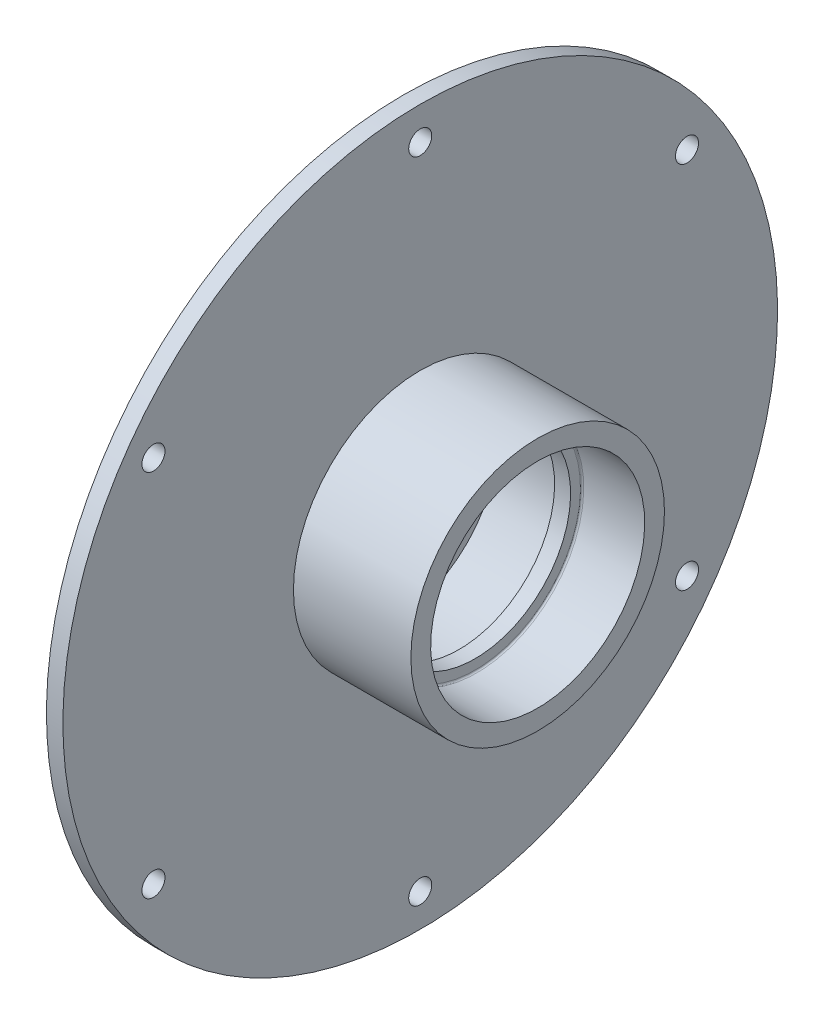
ISO-10303-21;
HEADER;
FILE_DESCRIPTION(('STEP AP214'),'2;1');
FILE_NAME('part.step','',(''),(''),'','','');
FILE_SCHEMA(('AUTOMOTIVE_DESIGN { 1 0 10303 214 1 1 1 1 }'));
ENDSEC;
DATA;
#1=APPLICATION_CONTEXT('core data for automotive mechanical design processes');
#2=APPLICATION_PROTOCOL_DEFINITION('international standard','automotive_design',2000,#1);
#3=PRODUCT_CONTEXT('',#1,'mechanical');
#4=PRODUCT('Part','Part','',(#3));
#5=PRODUCT_RELATED_PRODUCT_CATEGORY('part','',(#4));
#6=PRODUCT_DEFINITION_FORMATION('','',#4);
#7=PRODUCT_DEFINITION_CONTEXT('part definition',#1,'design');
#8=PRODUCT_DEFINITION('design','',#6,#7);
#9=PRODUCT_DEFINITION_SHAPE('','',#8);
#10=(LENGTH_UNIT() NAMED_UNIT(*) SI_UNIT(.MILLI.,.METRE.));
#11=(NAMED_UNIT(*) PLANE_ANGLE_UNIT() SI_UNIT($,.RADIAN.));
#12=(NAMED_UNIT(*) SI_UNIT($,.STERADIAN.) SOLID_ANGLE_UNIT());
#13=UNCERTAINTY_MEASURE_WITH_UNIT(LENGTH_MEASURE(1.E-05),#10,'distance_accuracy_value','');
#14=(GEOMETRIC_REPRESENTATION_CONTEXT(3) GLOBAL_UNCERTAINTY_ASSIGNED_CONTEXT((#13)) GLOBAL_UNIT_ASSIGNED_CONTEXT((#10,
#11,#12)) REPRESENTATION_CONTEXT('',''));
#15=CARTESIAN_POINT('',(0.,0.,0.));
#16=DIRECTION('',(0.,0.,1.));
#17=DIRECTION('',(1.,0.,0.));
#18=AXIS2_PLACEMENT_3D('',#15,#16,#17);
#19=CARTESIAN_POINT('',(89.,77.,0.));
#20=DIRECTION('',(1.,0.,0.));
#21=DIRECTION('',(0.,1.,0.));
#22=AXIS2_PLACEMENT_3D('',#19,#20,#21);
#23=PLANE('',#22);
#24=CARTESIAN_POINT('',(89.,0.,0.));
#25=DIRECTION('',(1.,0.,0.));
#26=DIRECTION('',(0.,1.,0.));
#27=AXIS2_PLACEMENT_3D('',#24,#25,#26);
#28=CIRCLE('',#27,77.);
#29=CARTESIAN_POINT('',(89.,77.,0.));
#30=VERTEX_POINT('',#29);
#31=EDGE_CURVE('E68',#30,#30,#28,.T.);
#32=ORIENTED_EDGE('',*,*,#31,.T.);
#33=EDGE_LOOP('',(#32));
#34=FACE_BOUND('',#33,.T.);
#35=CARTESIAN_POINT('',(89.,0.,0.));
#36=DIRECTION('',(1.,0.,0.));
#37=DIRECTION('',(0.,1.,0.));
#38=AXIS2_PLACEMENT_3D('',#35,#36,#37);
#39=CIRCLE('',#38,65.);
#40=CARTESIAN_POINT('',(89.,65.,0.));
#41=VERTEX_POINT('',#40);
#42=EDGE_CURVE('E171',#41,#41,#39,.T.);
#43=ORIENTED_EDGE('',*,*,#42,.F.);
#44=EDGE_LOOP('',(#43));
#45=FACE_BOUND('',#44,.T.);
#46=ADVANCED_FACE('F45',(#34,#45),#23,.T.);
#47=CARTESIAN_POINT('',(131.481481481482,0.,0.));
#48=DIRECTION('',(1.,0.,0.));
#49=DIRECTION('',(0.,1.,0.));
#50=AXIS2_PLACEMENT_3D('',#47,#48,#49);
#51=CYLINDRICAL_SURFACE('',#50,65.);
#52=CARTESIAN_POINT('',(52.,0.,0.));
#53=DIRECTION('',(1.,0.,0.));
#54=DIRECTION('',(0.,1.,0.));
#55=AXIS2_PLACEMENT_3D('',#52,#53,#54);
#56=CIRCLE('',#55,65.);
#57=CARTESIAN_POINT('',(52.,65.,0.));
#58=VERTEX_POINT('',#57);
#59=EDGE_CURVE('E60',#58,#58,#56,.F.);
#60=ORIENTED_EDGE('',*,*,#59,.T.);
#61=EDGE_LOOP('',(#60));
#62=FACE_BOUND('',#61,.T.);
#63=ORIENTED_EDGE('',*,*,#42,.T.);
#64=EDGE_LOOP('',(#63));
#65=FACE_BOUND('',#64,.T.);
#66=ADVANCED_FACE('F182',(#62,#65),#51,.F.);
#67=CARTESIAN_POINT('',(51.,65.,0.));
#68=DIRECTION('',(1.,0.,0.));
#69=DIRECTION('',(0.,1.,0.));
#70=AXIS2_PLACEMENT_3D('',#67,#68,#69);
#71=PLANE('',#70);
#72=CARTESIAN_POINT('',(51.,0.,0.));
#73=DIRECTION('',(1.,0.,0.));
#74=DIRECTION('',(0.,1.,0.));
#75=AXIS2_PLACEMENT_3D('',#72,#73,#74);
#76=CIRCLE('',#75,64.);
#77=CARTESIAN_POINT('',(51.,64.,0.));
#78=VERTEX_POINT('',#77);
#79=EDGE_CURVE('E175',#78,#78,#76,.T.);
#80=ORIENTED_EDGE('',*,*,#79,.T.);
#81=EDGE_LOOP('',(#80));
#82=FACE_BOUND('',#81,.T.);
#83=CARTESIAN_POINT('',(51.,0.,0.));
#84=DIRECTION('',(1.,0.,0.));
#85=DIRECTION('',(0.,1.,0.));
#86=AXIS2_PLACEMENT_3D('',#83,#84,#85);
#87=CIRCLE('',#86,58.);
#88=CARTESIAN_POINT('',(51.,58.,0.));
#89=VERTEX_POINT('',#88);
#90=EDGE_CURVE('E167',#89,#89,#87,.T.);
#91=ORIENTED_EDGE('',*,*,#90,.F.);
#92=EDGE_LOOP('',(#91));
#93=FACE_BOUND('',#92,.T.);
#94=ADVANCED_FACE('F191',(#82,#93),#71,.T.);
#95=CARTESIAN_POINT('',(131.481481481482,0.,0.));
#96=DIRECTION('',(1.,0.,0.));
#97=DIRECTION('',(0.,1.,0.));
#98=AXIS2_PLACEMENT_3D('',#95,#96,#97);
#99=CYLINDRICAL_SURFACE('',#98,58.);
#100=ORIENTED_EDGE('',*,*,#90,.T.);
#101=EDGE_LOOP('',(#100));
#102=FACE_BOUND('',#101,.T.);
#103=CARTESIAN_POINT('',(41.3,0.,0.));
#104=DIRECTION('',(1.,0.,0.));
#105=DIRECTION('',(0.,1.,0.));
#106=AXIS2_PLACEMENT_3D('',#103,#104,#105);
#107=CIRCLE('',#106,58.);
#108=CARTESIAN_POINT('',(41.3,58.,0.));
#109=VERTEX_POINT('',#108);
#110=EDGE_CURVE('E163',#109,#109,#107,.T.);
#111=ORIENTED_EDGE('',*,*,#110,.F.);
#112=EDGE_LOOP('',(#111));
#113=FACE_BOUND('',#112,.T.);
#114=ADVANCED_FACE('F194',(#102,#113),#99,.F.);
#115=CARTESIAN_POINT('',(41.3,58.,0.));
#116=DIRECTION('',(-1.,0.,0.));
#117=DIRECTION('',(0.,-1.,0.));
#118=AXIS2_PLACEMENT_3D('',#115,#116,#117);
#119=PLANE('',#118);
#120=CARTESIAN_POINT('',(41.3,0.,0.));
#121=DIRECTION('',(-1.,0.,0.));
#122=DIRECTION('',(0.,-1.,0.));
#123=AXIS2_PLACEMENT_3D('',#120,#121,#122);
#124=CIRCLE('',#123,64.);
#125=CARTESIAN_POINT('',(41.3,-64.,0.));
#126=VERTEX_POINT('',#125);
#127=EDGE_CURVE('E10',#126,#126,#124,.T.);
#128=ORIENTED_EDGE('',*,*,#127,.T.);
#129=EDGE_LOOP('',(#128));
#130=FACE_BOUND('',#129,.T.);
#131=ORIENTED_EDGE('',*,*,#110,.T.);
#132=EDGE_LOOP('',(#131));
#133=FACE_BOUND('',#132,.T.);
#134=ADVANCED_FACE('F200',(#130,#133),#119,.T.);
#135=CARTESIAN_POINT('',(131.481481481482,0.,0.));
#136=DIRECTION('',(1.,0.,0.));
#137=DIRECTION('',(0.,1.,0.));
#138=AXIS2_PLACEMENT_3D('',#135,#136,#137);
#139=CYLINDRICAL_SURFACE('',#138,65.);
#140=CARTESIAN_POINT('',(40.3,0.,0.));
#141=DIRECTION('',(-1.,0.,0.));
#142=DIRECTION('',(0.,-1.,0.));
#143=AXIS2_PLACEMENT_3D('',#140,#141,#142);
#144=CIRCLE('',#143,65.);
#145=CARTESIAN_POINT('',(40.3,-65.,0.));
#146=VERTEX_POINT('',#145);
#147=EDGE_CURVE('E54',#146,#146,#144,.F.);
#148=ORIENTED_EDGE('',*,*,#147,.T.);
#149=EDGE_LOOP('',(#148));
#150=FACE_BOUND('',#149,.T.);
#151=CARTESIAN_POINT('',(0.,0.,0.));
#152=DIRECTION('',(1.,0.,0.));
#153=DIRECTION('',(0.,1.,0.));
#154=AXIS2_PLACEMENT_3D('',#151,#152,#153);
#155=CIRCLE('',#154,65.);
#156=CARTESIAN_POINT('',(0.,65.,0.));
#157=VERTEX_POINT('',#156);
#158=EDGE_CURVE('E159',#157,#157,#155,.T.);
#159=ORIENTED_EDGE('',*,*,#158,.F.);
#160=EDGE_LOOP('',(#159));
#161=FACE_BOUND('',#160,.T.);
#162=ADVANCED_FACE('F205',(#150,#161),#139,.F.);
#163=CARTESIAN_POINT('',(0.,65.,0.));
#164=DIRECTION('',(1.,0.,0.));
#165=DIRECTION('',(0.,1.,0.));
#166=AXIS2_PLACEMENT_3D('',#163,#164,#165);
#167=PLANE('',#166);
#168=ORIENTED_EDGE('',*,*,#158,.T.);
#169=EDGE_LOOP('',(#168));
#170=FACE_BOUND('',#169,.T.);
#171=CARTESIAN_POINT('',(0.,0.,0.));
#172=DIRECTION('',(1.,0.,0.));
#173=DIRECTION('',(0.,1.,0.));
#174=AXIS2_PLACEMENT_3D('',#171,#172,#173);
#175=CIRCLE('',#174,55.);
#176=CARTESIAN_POINT('',(0.,55.,0.));
#177=VERTEX_POINT('',#176);
#178=EDGE_CURVE('E155',#177,#177,#175,.T.);
#179=ORIENTED_EDGE('',*,*,#178,.F.);
#180=EDGE_LOOP('',(#179));
#181=FACE_BOUND('',#180,.T.);
#182=ADVANCED_FACE('F210',(#170,#181),#167,.T.);
#183=CARTESIAN_POINT('',(131.481481481482,0.,0.));
#184=DIRECTION('',(1.,0.,0.));
#185=DIRECTION('',(0.,1.,0.));
#186=AXIS2_PLACEMENT_3D('',#183,#184,#185);
#187=CYLINDRICAL_SURFACE('',#186,55.);
#188=ORIENTED_EDGE('',*,*,#178,.T.);
#189=EDGE_LOOP('',(#188));
#190=FACE_BOUND('',#189,.T.);
#191=CARTESIAN_POINT('',(-5.,0.,0.));
#192=DIRECTION('',(1.,0.,0.));
#193=DIRECTION('',(0.,1.,0.));
#194=AXIS2_PLACEMENT_3D('',#191,#192,#193);
#195=CIRCLE('',#194,55.);
#196=CARTESIAN_POINT('',(-5.00000000000001,55.,0.));
#197=VERTEX_POINT('',#196);
#198=EDGE_CURVE('E151',#197,#197,#195,.T.);
#199=ORIENTED_EDGE('',*,*,#198,.F.);
#200=EDGE_LOOP('',(#199));
#201=FACE_BOUND('',#200,.T.);
#202=ADVANCED_FACE('F268',(#190,#201),#187,.F.);
#203=CARTESIAN_POINT('',(-5.,55.,0.));
#204=DIRECTION('',(-1.,0.,0.));
#205=DIRECTION('',(0.,-1.,0.));
#206=AXIS2_PLACEMENT_3D('',#203,#204,#205);
#207=PLANE('',#206);
#208=ORIENTED_EDGE('',*,*,#198,.T.);
#209=EDGE_LOOP('',(#208));
#210=FACE_BOUND('',#209,.T.);
#211=CARTESIAN_POINT('',(-5.,0.,0.));
#212=DIRECTION('',(1.,0.,0.));
#213=DIRECTION('',(0.,1.,0.));
#214=AXIS2_PLACEMENT_3D('',#211,#212,#213);
#215=CIRCLE('',#214,59.5);
#216=CARTESIAN_POINT('',(-5.00000000000001,59.5,0.));
#217=VERTEX_POINT('',#216);
#218=EDGE_CURVE('E147',#217,#217,#215,.T.);
#219=ORIENTED_EDGE('',*,*,#218,.F.);
#220=EDGE_LOOP('',(#219));
#221=FACE_BOUND('',#220,.T.);
#222=ADVANCED_FACE('F264',(#210,#221),#207,.T.);
#223=CARTESIAN_POINT('',(131.481481481482,0.,0.));
#224=DIRECTION('',(1.,0.,0.));
#225=DIRECTION('',(0.,1.,0.));
#226=AXIS2_PLACEMENT_3D('',#223,#224,#225);
#227=CYLINDRICAL_SURFACE('',#226,59.5);
#228=ORIENTED_EDGE('',*,*,#218,.T.);
#229=EDGE_LOOP('',(#228));
#230=FACE_BOUND('',#229,.T.);
#231=CARTESIAN_POINT('',(-15.,0.,0.));
#232=DIRECTION('',(1.,0.,0.));
#233=DIRECTION('',(0.,1.,0.));
#234=AXIS2_PLACEMENT_3D('',#231,#232,#233);
#235=CIRCLE('',#234,59.5);
#236=CARTESIAN_POINT('',(-15.,59.5,0.));
#237=VERTEX_POINT('',#236);
#238=EDGE_CURVE('E143',#237,#237,#235,.T.);
#239=ORIENTED_EDGE('',*,*,#238,.F.);
#240=EDGE_LOOP('',(#239));
#241=FACE_BOUND('',#240,.T.);
#242=ADVANCED_FACE('F260',(#230,#241),#227,.F.);
#243=CARTESIAN_POINT('',(-15.,0.,0.));
#244=DIRECTION('',(1.,0.,0.));
#245=DIRECTION('',(0.,1.,0.));
#246=AXIS2_PLACEMENT_3D('',#243,#244,#245);
#247=TOROIDAL_SURFACE('',#246,61.5,2.);
#248=ORIENTED_EDGE('',*,*,#238,.T.);
#249=EDGE_LOOP('',(#248));
#250=FACE_BOUND('',#249,.T.);
#251=CARTESIAN_POINT('',(-17.,0.,0.));
#252=DIRECTION('',(1.,0.,0.));
#253=DIRECTION('',(0.,1.,0.));
#254=AXIS2_PLACEMENT_3D('',#251,#252,#253);
#255=CIRCLE('',#254,61.5);
#256=CARTESIAN_POINT('',(-17.,61.5,0.));
#257=VERTEX_POINT('',#256);
#258=EDGE_CURVE('E139',#257,#257,#255,.T.);
#259=ORIENTED_EDGE('',*,*,#258,.F.);
#260=EDGE_LOOP('',(#259));
#261=FACE_BOUND('',#260,.T.);
#262=ADVANCED_FACE('F256',(#250,#261),#247,.T.);
#263=CARTESIAN_POINT('',(-17.,61.5,0.));
#264=DIRECTION('',(-1.,0.,0.));
#265=DIRECTION('',(0.,-1.,0.));
#266=AXIS2_PLACEMENT_3D('',#263,#264,#265);
#267=PLANE('',#266);
#268=ORIENTED_EDGE('',*,*,#258,.T.);
#269=EDGE_LOOP('',(#268));
#270=FACE_BOUND('',#269,.T.);
#271=CARTESIAN_POINT('',(-17.,0.,0.));
#272=DIRECTION('',(1.,0.,0.));
#273=DIRECTION('',(0.,1.,0.));
#274=AXIS2_PLACEMENT_3D('',#271,#272,#273);
#275=CIRCLE('',#274,109.5);
#276=CARTESIAN_POINT('',(-17.,109.5,0.));
#277=VERTEX_POINT('',#276);
#278=EDGE_CURVE('E135',#277,#277,#275,.T.);
#279=ORIENTED_EDGE('',*,*,#278,.F.);
#280=EDGE_LOOP('',(#279));
#281=FACE_BOUND('',#280,.T.);
#282=ADVANCED_FACE('F252',(#270,#281),#267,.T.);
#283=CARTESIAN_POINT('',(3.,0.,0.));
#284=DIRECTION('',(1.,0.,0.));
#285=DIRECTION('',(0.,1.,0.));
#286=AXIS2_PLACEMENT_3D('',#283,#284,#285);
#287=TOROIDAL_SURFACE('',#286,109.5,20.);
#288=ORIENTED_EDGE('',*,*,#278,.T.);
#289=EDGE_LOOP('',(#288));
#290=FACE_BOUND('',#289,.T.);
#291=CARTESIAN_POINT('',(3.00000000000003,0.,0.));
#292=DIRECTION('',(1.,0.,0.));
#293=DIRECTION('',(0.,1.,0.));
#294=AXIS2_PLACEMENT_3D('',#291,#292,#293);
#295=CIRCLE('',#294,129.5);
#296=CARTESIAN_POINT('',(3.00000000000001,129.5,0.));
#297=VERTEX_POINT('',#296);
#298=EDGE_CURVE('E131',#297,#297,#295,.T.);
#299=ORIENTED_EDGE('',*,*,#298,.F.);
#300=EDGE_LOOP('',(#299));
#301=FACE_BOUND('',#300,.T.);
#302=ADVANCED_FACE('F248',(#290,#301),#287,.T.);
#303=CARTESIAN_POINT('',(131.481481481482,0.,0.));
#304=DIRECTION('',(1.,0.,0.));
#305=DIRECTION('',(0.,1.,0.));
#306=AXIS2_PLACEMENT_3D('',#303,#304,#305);
#307=CYLINDRICAL_SURFACE('',#306,129.5);
#308=ORIENTED_EDGE('',*,*,#298,.T.);
#309=EDGE_LOOP('',(#308));
#310=FACE_BOUND('',#309,.T.);
#311=CARTESIAN_POINT('',(7.68603245853013,0.,0.));
#312=DIRECTION('',(1.,0.,0.));
#313=DIRECTION('',(0.,1.,0.));
#314=AXIS2_PLACEMENT_3D('',#311,#312,#313);
#315=CIRCLE('',#314,129.5);
#316=CARTESIAN_POINT('',(7.68603245853011,129.5,0.));
#317=VERTEX_POINT('',#316);
#318=EDGE_CURVE('E127',#317,#317,#315,.T.);
#319=ORIENTED_EDGE('',*,*,#318,.F.);
#320=EDGE_LOOP('',(#319));
#321=FACE_BOUND('',#320,.T.);
#322=ADVANCED_FACE('F244',(#310,#321),#307,.T.);
#323=CARTESIAN_POINT('',(7.68603245853012,129.5,0.));
#324=DIRECTION('',(-1.,0.,0.));
#325=DIRECTION('',(0.,-1.,0.));
#326=AXIS2_PLACEMENT_3D('',#323,#324,#325);
#327=PLANE('',#326);
#328=CARTESIAN_POINT('',(7.68603245853011,197.,0.));
#329=DIRECTION('',(-1.,0.,0.));
#330=DIRECTION('',(0.,0.,1.));
#331=AXIS2_PLACEMENT_3D('',#328,#329,#330);
#332=CIRCLE('',#331,6.99999999999998);
#333=CARTESIAN_POINT('',(7.68603245853011,197.,6.99999999999998));
#334=VERTEX_POINT('',#333);
#335=EDGE_CURVE('E100',#334,#334,#332,.T.);
#336=ORIENTED_EDGE('',*,*,#335,.F.);
#337=EDGE_LOOP('',(#336));
#338=FACE_BOUND('',#337,.T.);
#339=CARTESIAN_POINT('',(7.68603245853015,-197.,0.));
#340=DIRECTION('',(-1.,0.,0.));
#341=DIRECTION('',(0.,0.,1.));
#342=AXIS2_PLACEMENT_3D('',#339,#340,#341);
#343=CIRCLE('',#342,6.99999999999998);
#344=CARTESIAN_POINT('',(7.68603245853015,-197.,6.99999999999998));
#345=VERTEX_POINT('',#344);
#346=EDGE_CURVE('E87',#345,#345,#343,.T.);
#347=ORIENTED_EDGE('',*,*,#346,.F.);
#348=EDGE_LOOP('',(#347));
#349=FACE_BOUND('',#348,.T.);
#350=CARTESIAN_POINT('',(7.68603245853014,-112.093710795923,162.));
#351=DIRECTION('',(-1.,0.,0.));
#352=DIRECTION('',(0.,0.,1.));
#353=AXIS2_PLACEMENT_3D('',#350,#351,#352);
#354=CIRCLE('',#353,6.99999999999999);
#355=CARTESIAN_POINT('',(7.68603245853014,-112.093710795923,169.));
#356=VERTEX_POINT('',#355);
#357=EDGE_CURVE('E83',#356,#356,#354,.T.);
#358=ORIENTED_EDGE('',*,*,#357,.F.);
#359=EDGE_LOOP('',(#358));
#360=FACE_BOUND('',#359,.T.);
#361=CARTESIAN_POINT('',(7.68603245853014,-112.093710795923,-162.));
#362=DIRECTION('',(-1.,0.,0.));
#363=DIRECTION('',(0.,0.,1.));
#364=AXIS2_PLACEMENT_3D('',#361,#362,#363);
#365=CIRCLE('',#364,6.99999999999999);
#366=CARTESIAN_POINT('',(7.68603245853014,-112.093710795923,-155.));
#367=VERTEX_POINT('',#366);
#368=EDGE_CURVE('E79',#367,#367,#365,.T.);
#369=ORIENTED_EDGE('',*,*,#368,.F.);
#370=EDGE_LOOP('',(#369));
#371=FACE_BOUND('',#370,.T.);
#372=CARTESIAN_POINT('',(7.68603245853012,112.093710795923,-162.));
#373=DIRECTION('',(-1.,0.,0.));
#374=DIRECTION('',(0.,0.,1.));
#375=AXIS2_PLACEMENT_3D('',#372,#373,#374);
#376=CIRCLE('',#375,6.99999999999999);
#377=CARTESIAN_POINT('',(7.68603245853012,112.093710795923,-155.));
#378=VERTEX_POINT('',#377);
#379=EDGE_CURVE('E74',#378,#378,#376,.T.);
#380=ORIENTED_EDGE('',*,*,#379,.F.);
#381=EDGE_LOOP('',(#380));
#382=FACE_BOUND('',#381,.T.);
#383=CARTESIAN_POINT('',(7.68603245853012,112.093710795923,162.));
#384=DIRECTION('',(-1.,0.,0.));
#385=DIRECTION('',(0.,0.,1.));
#386=AXIS2_PLACEMENT_3D('',#383,#384,#385);
#387=CIRCLE('',#386,6.99999999999999);
#388=CARTESIAN_POINT('',(7.68603245853012,112.093710795923,169.));
#389=VERTEX_POINT('',#388);
#390=EDGE_CURVE('E69',#389,#389,#387,.T.);
#391=ORIENTED_EDGE('',*,*,#390,.F.);
#392=EDGE_LOOP('',(#391));
#393=FACE_BOUND('',#392,.T.);
#394=ORIENTED_EDGE('',*,*,#318,.T.);
#395=EDGE_LOOP('',(#394));
#396=FACE_BOUND('',#395,.T.);
#397=CARTESIAN_POINT('',(7.68603245853014,0.,0.));
#398=DIRECTION('',(1.,0.,0.));
#399=DIRECTION('',(0.,1.,0.));
#400=AXIS2_PLACEMENT_3D('',#397,#398,#399);
#401=CIRCLE('',#400,217.);
#402=CARTESIAN_POINT('',(7.68603245853011,217.,0.));
#403=VERTEX_POINT('',#402);
#404=EDGE_CURVE('E123',#403,#403,#401,.T.);
#405=ORIENTED_EDGE('',*,*,#404,.F.);
#406=EDGE_LOOP('',(#405));
#407=FACE_BOUND('',#406,.T.);
#408=ADVANCED_FACE('F240',(#338,#349,#360,#371,#382,#393,#396,#407),#327,.T.);
#409=CARTESIAN_POINT('',(131.481481481482,0.,0.));
#410=DIRECTION('',(1.,0.,0.));
#411=DIRECTION('',(0.,1.,0.));
#412=AXIS2_PLACEMENT_3D('',#409,#410,#411);
#413=CYLINDRICAL_SURFACE('',#412,217.);
#414=ORIENTED_EDGE('',*,*,#404,.T.);
#415=EDGE_LOOP('',(#414));
#416=FACE_BOUND('',#415,.T.);
#417=CARTESIAN_POINT('',(17.6860324585301,0.,0.));
#418=DIRECTION('',(1.,0.,0.));
#419=DIRECTION('',(0.,1.,0.));
#420=AXIS2_PLACEMENT_3D('',#417,#418,#419);
#421=CIRCLE('',#420,217.);
#422=CARTESIAN_POINT('',(17.6860324585301,217.,0.));
#423=VERTEX_POINT('',#422);
#424=EDGE_CURVE('E119',#423,#423,#421,.T.);
#425=ORIENTED_EDGE('',*,*,#424,.F.);
#426=EDGE_LOOP('',(#425));
#427=FACE_BOUND('',#426,.T.);
#428=ADVANCED_FACE('F231',(#416,#427),#413,.T.);
#429=CARTESIAN_POINT('',(17.6860324585301,217.,0.));
#430=DIRECTION('',(1.,0.,0.));
#431=DIRECTION('',(0.,1.,0.));
#432=AXIS2_PLACEMENT_3D('',#429,#430,#431);
#433=PLANE('',#432);
#434=CARTESIAN_POINT('',(17.6860324585301,197.,0.));
#435=DIRECTION('',(1.,0.,0.));
#436=DIRECTION('',(0.,1.,0.));
#437=AXIS2_PLACEMENT_3D('',#434,#435,#436);
#438=CIRCLE('',#437,6.99999999999998);
#439=CARTESIAN_POINT('',(17.6860324585301,204.,0.));
#440=VERTEX_POINT('',#439);
#441=EDGE_CURVE('E49',#440,#440,#438,.T.);
#442=ORIENTED_EDGE('',*,*,#441,.F.);
#443=EDGE_LOOP('',(#442));
#444=FACE_BOUND('',#443,.T.);
#445=CARTESIAN_POINT('',(17.6860324585302,-197.,0.));
#446=DIRECTION('',(1.,0.,0.));
#447=DIRECTION('',(0.,1.,0.));
#448=AXIS2_PLACEMENT_3D('',#445,#446,#447);
#449=CIRCLE('',#448,6.99999999999998);
#450=CARTESIAN_POINT('',(17.6860324585302,-190.,0.));
#451=VERTEX_POINT('',#450);
#452=EDGE_CURVE('E84',#451,#451,#449,.T.);
#453=ORIENTED_EDGE('',*,*,#452,.F.);
#454=EDGE_LOOP('',(#453));
#455=FACE_BOUND('',#454,.T.);
#456=CARTESIAN_POINT('',(17.6860324585301,-112.093710795923,162.));
#457=DIRECTION('',(1.,0.,0.));
#458=DIRECTION('',(0.,1.,0.));
#459=AXIS2_PLACEMENT_3D('',#456,#457,#458);
#460=CIRCLE('',#459,6.99999999999999);
#461=CARTESIAN_POINT('',(17.6860324585301,-105.093710795923,162.));
#462=VERTEX_POINT('',#461);
#463=EDGE_CURVE('E80',#462,#462,#460,.T.);
#464=ORIENTED_EDGE('',*,*,#463,.F.);
#465=EDGE_LOOP('',(#464));
#466=FACE_BOUND('',#465,.T.);
#467=CARTESIAN_POINT('',(17.6860324585301,-112.093710795923,-162.));
#468=DIRECTION('',(1.,0.,0.));
#469=DIRECTION('',(0.,1.,0.));
#470=AXIS2_PLACEMENT_3D('',#467,#468,#469);
#471=CIRCLE('',#470,6.99999999999999);
#472=CARTESIAN_POINT('',(17.6860324585301,-105.093710795923,-162.));
#473=VERTEX_POINT('',#472);
#474=EDGE_CURVE('E75',#473,#473,#471,.T.);
#475=ORIENTED_EDGE('',*,*,#474,.F.);
#476=EDGE_LOOP('',(#475));
#477=FACE_BOUND('',#476,.T.);
#478=CARTESIAN_POINT('',(17.6860324585301,112.093710795923,-162.));
#479=DIRECTION('',(1.,0.,0.));
#480=DIRECTION('',(0.,1.,0.));
#481=AXIS2_PLACEMENT_3D('',#478,#479,#480);
#482=CIRCLE('',#481,6.99999999999999);
#483=CARTESIAN_POINT('',(17.6860324585301,119.093710795923,-162.));
#484=VERTEX_POINT('',#483);
#485=EDGE_CURVE('E70',#484,#484,#482,.T.);
#486=ORIENTED_EDGE('',*,*,#485,.F.);
#487=EDGE_LOOP('',(#486));
#488=FACE_BOUND('',#487,.T.);
#489=CARTESIAN_POINT('',(17.6860324585301,112.093710795923,162.));
#490=DIRECTION('',(1.,0.,0.));
#491=DIRECTION('',(0.,1.,0.));
#492=AXIS2_PLACEMENT_3D('',#489,#490,#491);
#493=CIRCLE('',#492,6.99999999999999);
#494=CARTESIAN_POINT('',(17.6860324585301,119.093710795923,162.));
#495=VERTEX_POINT('',#494);
#496=EDGE_CURVE('E64',#495,#495,#493,.T.);
#497=ORIENTED_EDGE('',*,*,#496,.F.);
#498=EDGE_LOOP('',(#497));
#499=FACE_BOUND('',#498,.T.);
#500=ORIENTED_EDGE('',*,*,#424,.T.);
#501=EDGE_LOOP('',(#500));
#502=FACE_BOUND('',#501,.T.);
#503=CARTESIAN_POINT('',(17.6860324585301,0.,0.));
#504=DIRECTION('',(1.,0.,0.));
#505=DIRECTION('',(0.,1.,0.));
#506=AXIS2_PLACEMENT_3D('',#503,#504,#505);
#507=CIRCLE('',#506,77.);
#508=CARTESIAN_POINT('',(17.6860324585301,77.,0.));
#509=VERTEX_POINT('',#508);
#510=EDGE_CURVE('E115',#509,#509,#507,.T.);
#511=ORIENTED_EDGE('',*,*,#510,.F.);
#512=EDGE_LOOP('',(#511));
#513=FACE_BOUND('',#512,.T.);
#514=ADVANCED_FACE('F225',(#444,#455,#466,#477,#488,#499,#502,#513),#433,.T.);
#515=CARTESIAN_POINT('',(131.481481481482,0.,0.));
#516=DIRECTION('',(1.,0.,0.));
#517=DIRECTION('',(0.,1.,0.));
#518=AXIS2_PLACEMENT_3D('',#515,#516,#517);
#519=CYLINDRICAL_SURFACE('',#518,77.);
#520=ORIENTED_EDGE('',*,*,#510,.T.);
#521=EDGE_LOOP('',(#520));
#522=FACE_BOUND('',#521,.T.);
#523=ORIENTED_EDGE('',*,*,#31,.F.);
#524=EDGE_LOOP('',(#523));
#525=FACE_BOUND('',#524,.T.);
#526=ADVANCED_FACE('F188',(#522,#525),#519,.T.);
#527=CARTESIAN_POINT('',(52.,0.,0.));
#528=DIRECTION('',(1.,0.,0.));
#529=DIRECTION('',(0.,1.,0.));
#530=AXIS2_PLACEMENT_3D('',#527,#528,#529);
#531=TOROIDAL_SURFACE('',#530,64.,1.);
#532=ORIENTED_EDGE('',*,*,#59,.F.);
#533=EDGE_LOOP('',(#532));
#534=FACE_BOUND('',#533,.T.);
#535=ORIENTED_EDGE('',*,*,#79,.F.);
#536=EDGE_LOOP('',(#535));
#537=FACE_BOUND('',#536,.T.);
#538=ADVANCED_FACE('F185',(#534,#537),#531,.F.);
#539=CARTESIAN_POINT('',(40.3,0.,0.));
#540=DIRECTION('',(-1.,0.,0.));
#541=DIRECTION('',(0.,-1.,0.));
#542=AXIS2_PLACEMENT_3D('',#539,#540,#541);
#543=TOROIDAL_SURFACE('',#542,64.,1.);
#544=ORIENTED_EDGE('',*,*,#127,.F.);
#545=EDGE_LOOP('',(#544));
#546=FACE_BOUND('',#545,.T.);
#547=ORIENTED_EDGE('',*,*,#147,.F.);
#548=EDGE_LOOP('',(#547));
#549=FACE_BOUND('',#548,.T.);
#550=ADVANCED_FACE('F47',(#546,#549),#543,.F.);
#551=CARTESIAN_POINT('',(7.68603245853012,112.093710795923,162.));
#552=DIRECTION('',(-1.,0.,0.));
#553=DIRECTION('',(0.,0.,1.));
#554=AXIS2_PLACEMENT_3D('',#551,#552,#553);
#555=CYLINDRICAL_SURFACE('',#554,6.99999999999999);
#556=ORIENTED_EDGE('',*,*,#496,.T.);
#557=EDGE_LOOP('',(#556));
#558=FACE_BOUND('',#557,.T.);
#559=ORIENTED_EDGE('',*,*,#390,.T.);
#560=EDGE_LOOP('',(#559));
#561=FACE_BOUND('',#560,.T.);
#562=ADVANCED_FACE('F235',(#558,#561),#555,.F.);
#563=CARTESIAN_POINT('',(7.68603245853012,112.093710795923,-162.));
#564=DIRECTION('',(-1.,0.,0.));
#565=DIRECTION('',(0.,0.,1.));
#566=AXIS2_PLACEMENT_3D('',#563,#564,#565);
#567=CYLINDRICAL_SURFACE('',#566,6.99999999999999);
#568=ORIENTED_EDGE('',*,*,#485,.T.);
#569=EDGE_LOOP('',(#568));
#570=FACE_BOUND('',#569,.T.);
#571=ORIENTED_EDGE('',*,*,#379,.T.);
#572=EDGE_LOOP('',(#571));
#573=FACE_BOUND('',#572,.T.);
#574=ADVANCED_FACE('F363',(#570,#573),#567,.F.);
#575=CARTESIAN_POINT('',(7.68603245853015,-112.093710795923,-162.));
#576=DIRECTION('',(-1.,0.,0.));
#577=DIRECTION('',(0.,0.,1.));
#578=AXIS2_PLACEMENT_3D('',#575,#576,#577);
#579=CYLINDRICAL_SURFACE('',#578,6.99999999999999);
#580=ORIENTED_EDGE('',*,*,#474,.T.);
#581=EDGE_LOOP('',(#580));
#582=FACE_BOUND('',#581,.T.);
#583=ORIENTED_EDGE('',*,*,#368,.T.);
#584=EDGE_LOOP('',(#583));
#585=FACE_BOUND('',#584,.T.);
#586=ADVANCED_FACE('F376',(#582,#585),#579,.F.);
#587=CARTESIAN_POINT('',(7.68603245853015,-112.093710795923,162.));
#588=DIRECTION('',(-1.,0.,0.));
#589=DIRECTION('',(0.,0.,1.));
#590=AXIS2_PLACEMENT_3D('',#587,#588,#589);
#591=CYLINDRICAL_SURFACE('',#590,6.99999999999999);
#592=ORIENTED_EDGE('',*,*,#463,.T.);
#593=EDGE_LOOP('',(#592));
#594=FACE_BOUND('',#593,.T.);
#595=ORIENTED_EDGE('',*,*,#357,.T.);
#596=EDGE_LOOP('',(#595));
#597=FACE_BOUND('',#596,.T.);
#598=ADVANCED_FACE('F388',(#594,#597),#591,.F.);
#599=CARTESIAN_POINT('',(7.68603245853016,-197.,0.));
#600=DIRECTION('',(-1.,0.,0.));
#601=DIRECTION('',(0.,0.,1.));
#602=AXIS2_PLACEMENT_3D('',#599,#600,#601);
#603=CYLINDRICAL_SURFACE('',#602,6.99999999999998);
#604=ORIENTED_EDGE('',*,*,#452,.T.);
#605=EDGE_LOOP('',(#604));
#606=FACE_BOUND('',#605,.T.);
#607=ORIENTED_EDGE('',*,*,#346,.T.);
#608=EDGE_LOOP('',(#607));
#609=FACE_BOUND('',#608,.T.);
#610=ADVANCED_FACE('F401',(#606,#609),#603,.F.);
#611=CARTESIAN_POINT('',(7.68603245853011,197.,0.));
#612=DIRECTION('',(-1.,0.,0.));
#613=DIRECTION('',(0.,0.,1.));
#614=AXIS2_PLACEMENT_3D('',#611,#612,#613);
#615=CYLINDRICAL_SURFACE('',#614,6.99999999999998);
#616=ORIENTED_EDGE('',*,*,#441,.T.);
#617=EDGE_LOOP('',(#616));
#618=FACE_BOUND('',#617,.T.);
#619=ORIENTED_EDGE('',*,*,#335,.T.);
#620=EDGE_LOOP('',(#619));
#621=FACE_BOUND('',#620,.T.);
#622=ADVANCED_FACE('F414',(#618,#621),#615,.F.);
#623=CLOSED_SHELL('',(#46,#66,#94,#114,#134,#162,#182,#202,#222,#242,#262,#282,#302,#322,#408,
#428,#514,#526,#538,#550,#562,#574,#586,#598,#610,#622));
#624=MANIFOLD_SOLID_BREP('B2',#623);
#625=ADVANCED_BREP_SHAPE_REPRESENTATION('',(#18,#624),#14);
#626=SHAPE_DEFINITION_REPRESENTATION(#9,#625);
ENDSEC;
END-ISO-10303-21;
